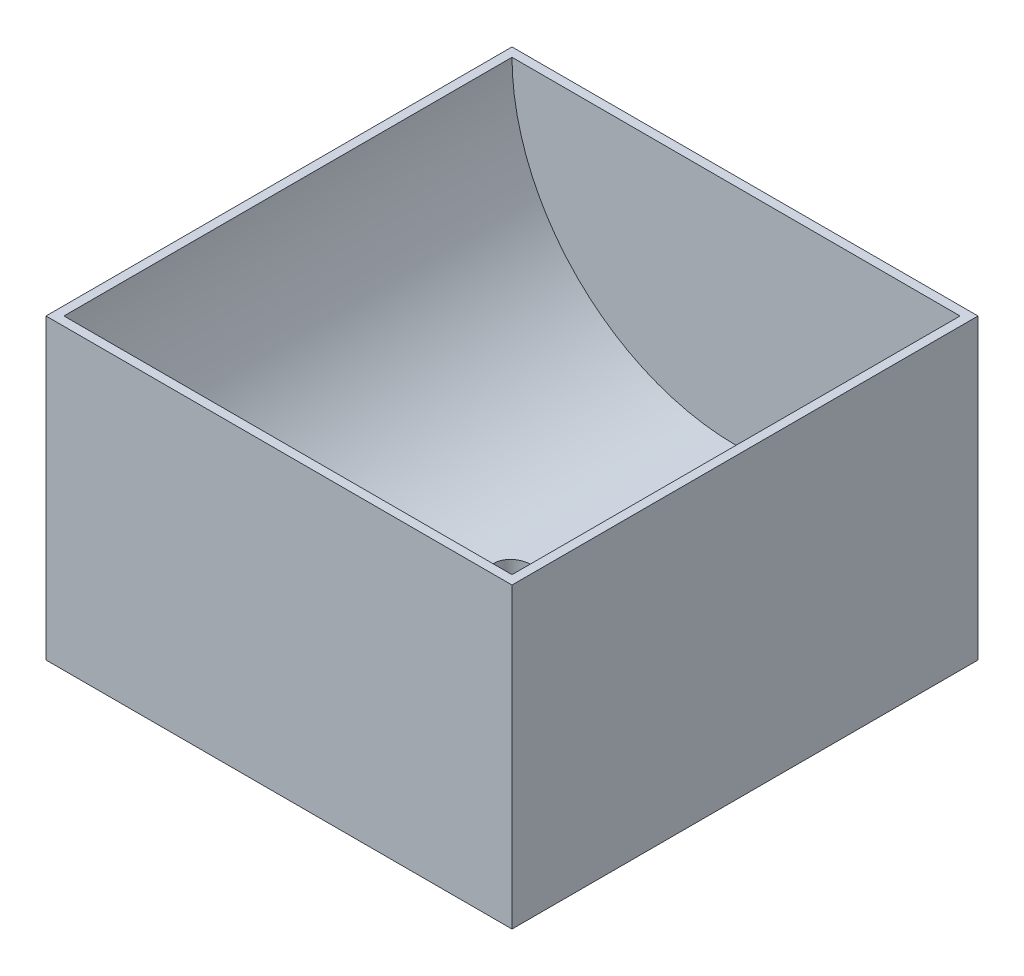
ISO-10303-21;
HEADER;
FILE_DESCRIPTION(('STEP AP214'),'2;1');
FILE_NAME('part.step','',(''),(''),'','','');
FILE_SCHEMA(('AUTOMOTIVE_DESIGN { 1 0 10303 214 1 1 1 1 }'));
ENDSEC;
DATA;
#1=APPLICATION_CONTEXT('core data for automotive mechanical design processes');
#2=APPLICATION_PROTOCOL_DEFINITION('international standard','automotive_design',2000,#1);
#3=PRODUCT_CONTEXT('',#1,'mechanical');
#4=PRODUCT('Part','Part','',(#3));
#5=PRODUCT_RELATED_PRODUCT_CATEGORY('part','',(#4));
#6=PRODUCT_DEFINITION_FORMATION('','',#4);
#7=PRODUCT_DEFINITION_CONTEXT('part definition',#1,'design');
#8=PRODUCT_DEFINITION('design','',#6,#7);
#9=PRODUCT_DEFINITION_SHAPE('','',#8);
#10=(LENGTH_UNIT() NAMED_UNIT(*) SI_UNIT(.MILLI.,.METRE.));
#11=(NAMED_UNIT(*) PLANE_ANGLE_UNIT() SI_UNIT($,.RADIAN.));
#12=(NAMED_UNIT(*) SI_UNIT($,.STERADIAN.) SOLID_ANGLE_UNIT());
#13=UNCERTAINTY_MEASURE_WITH_UNIT(LENGTH_MEASURE(1.E-05),#10,'distance_accuracy_value','');
#14=(GEOMETRIC_REPRESENTATION_CONTEXT(3) GLOBAL_UNCERTAINTY_ASSIGNED_CONTEXT((#13)) GLOBAL_UNIT_ASSIGNED_CONTEXT((#10,
#11,#12)) REPRESENTATION_CONTEXT('',''));
#15=CARTESIAN_POINT('',(0.,0.,0.));
#16=DIRECTION('',(0.,0.,1.));
#17=DIRECTION('',(1.,0.,0.));
#18=AXIS2_PLACEMENT_3D('',#15,#16,#17);
#19=CARTESIAN_POINT('',(-3.75277674973257,-66.5,6.5));
#20=DIRECTION('',(0.866025403784439,0.,-0.5));
#21=DIRECTION('',(-0.5,0.,-0.866025403784439));
#22=AXIS2_PLACEMENT_3D('',#19,#20,#21);
#23=PLANE('',#22);
#24=DIRECTION('',(0.,1.,0.));
#25=VECTOR('',#24,1.);
#26=CARTESIAN_POINT('',(-3.75277674973257,-66.5,6.5));
#27=LINE('',#26,#25);
#28=CARTESIAN_POINT('',(-3.75277674973257,-59.5,6.5));
#29=VERTEX_POINT('',#28);
#30=CARTESIAN_POINT('',(-3.75277674973257,-53.,6.5));
#31=VERTEX_POINT('',#30);
#32=EDGE_CURVE('E145',#29,#31,#27,.T.);
#33=ORIENTED_EDGE('',*,*,#32,.F.);
#34=DIRECTION('',(-0.5,0.,-0.866025403784439));
#35=VECTOR('',#34,1.);
#36=CARTESIAN_POINT('',(-3.75277674973257,-59.5,6.5));
#37=LINE('',#36,#35);
#38=CARTESIAN_POINT('',(-7.50555349946513,-59.5,0.));
#39=VERTEX_POINT('',#38);
#40=EDGE_CURVE('E55',#29,#39,#37,.T.);
#41=ORIENTED_EDGE('',*,*,#40,.T.);
#42=DIRECTION('',(0.,1.,0.));
#43=VECTOR('',#42,1.);
#44=CARTESIAN_POINT('',(-7.50555349946513,-66.5,0.));
#45=LINE('',#44,#43);
#46=CARTESIAN_POINT('',(-7.50555349946513,-53.,0.));
#47=VERTEX_POINT('',#46);
#48=EDGE_CURVE('E159',#39,#47,#45,.T.);
#49=ORIENTED_EDGE('',*,*,#48,.T.);
#50=DIRECTION('',(-0.5,0.,-0.866025403784438));
#51=VECTOR('',#50,1.);
#52=CARTESIAN_POINT('',(-3.75277674973257,-53.,6.5));
#53=LINE('',#52,#51);
#54=EDGE_CURVE('E487',#31,#47,#53,.T.);
#55=ORIENTED_EDGE('',*,*,#54,.F.);
#56=EDGE_LOOP('',(#33,#41,#49,#55));
#57=FACE_BOUND('',#56,.T.);
#58=ADVANCED_FACE('F39',(#57),#23,.T.);
#59=CARTESIAN_POINT('',(-7.50555349946513,-66.5,0.));
#60=DIRECTION('',(0.866025403784439,0.,0.5));
#61=DIRECTION('',(0.5,0.,-0.866025403784439));
#62=AXIS2_PLACEMENT_3D('',#59,#60,#61);
#63=PLANE('',#62);
#64=ORIENTED_EDGE('',*,*,#48,.F.);
#65=DIRECTION('',(0.5,0.,-0.866025403784439));
#66=VECTOR('',#65,1.);
#67=CARTESIAN_POINT('',(-7.50555349946513,-59.5,0.));
#68=LINE('',#67,#66);
#69=CARTESIAN_POINT('',(-3.75277674973257,-59.5,-6.5));
#70=VERTEX_POINT('',#69);
#71=EDGE_CURVE('E492',#39,#70,#68,.T.);
#72=ORIENTED_EDGE('',*,*,#71,.T.);
#73=DIRECTION('',(0.,1.,0.));
#74=VECTOR('',#73,1.);
#75=CARTESIAN_POINT('',(-3.75277674973257,-66.5,-6.5));
#76=LINE('',#75,#74);
#77=CARTESIAN_POINT('',(-3.75277674973257,-53.,-6.5));
#78=VERTEX_POINT('',#77);
#79=EDGE_CURVE('E156',#70,#78,#76,.T.);
#80=ORIENTED_EDGE('',*,*,#79,.T.);
#81=DIRECTION('',(0.5,0.,-0.866025403784439));
#82=VECTOR('',#81,1.);
#83=CARTESIAN_POINT('',(-7.50555349946513,-53.,0.));
#84=LINE('',#83,#82);
#85=EDGE_CURVE('E483',#47,#78,#84,.T.);
#86=ORIENTED_EDGE('',*,*,#85,.F.);
#87=EDGE_LOOP('',(#64,#72,#80,#86));
#88=FACE_BOUND('',#87,.T.);
#89=ADVANCED_FACE('F278',(#88),#63,.T.);
#90=CARTESIAN_POINT('',(-3.75277674973257,-66.5,-6.5));
#91=DIRECTION('',(0.,0.,1.));
#92=DIRECTION('',(1.,0.,0.));
#93=AXIS2_PLACEMENT_3D('',#90,#91,#92);
#94=PLANE('',#93);
#95=ORIENTED_EDGE('',*,*,#79,.F.);
#96=DIRECTION('',(1.,0.,0.));
#97=VECTOR('',#96,1.);
#98=CARTESIAN_POINT('',(-3.75277674973257,-59.5,-6.5));
#99=LINE('',#98,#97);
#100=CARTESIAN_POINT('',(3.75277674973257,-59.5,-6.5));
#101=VERTEX_POINT('',#100);
#102=EDGE_CURVE('E496',#70,#101,#99,.T.);
#103=ORIENTED_EDGE('',*,*,#102,.T.);
#104=DIRECTION('',(0.,1.,0.));
#105=VECTOR('',#104,1.);
#106=CARTESIAN_POINT('',(3.75277674973257,-66.5,-6.5));
#107=LINE('',#106,#105);
#108=CARTESIAN_POINT('',(3.75277674973257,-53.,-6.5));
#109=VERTEX_POINT('',#108);
#110=EDGE_CURVE('E149',#101,#109,#107,.T.);
#111=ORIENTED_EDGE('',*,*,#110,.T.);
#112=DIRECTION('',(1.,0.,0.));
#113=VECTOR('',#112,1.);
#114=CARTESIAN_POINT('',(-3.75277674973257,-53.,-6.5));
#115=LINE('',#114,#113);
#116=EDGE_CURVE('E478',#78,#109,#115,.T.);
#117=ORIENTED_EDGE('',*,*,#116,.F.);
#118=EDGE_LOOP('',(#95,#103,#111,#117));
#119=FACE_BOUND('',#118,.T.);
#120=ADVANCED_FACE('F283',(#119),#94,.T.);
#121=CARTESIAN_POINT('',(3.75277674973257,-66.5,-6.5));
#122=DIRECTION('',(-0.866025403784439,0.,0.5));
#123=DIRECTION('',(0.5,0.,0.866025403784439));
#124=AXIS2_PLACEMENT_3D('',#121,#122,#123);
#125=PLANE('',#124);
#126=ORIENTED_EDGE('',*,*,#110,.F.);
#127=DIRECTION('',(0.5,0.,0.866025403784439));
#128=VECTOR('',#127,1.);
#129=CARTESIAN_POINT('',(3.75277674973257,-59.5,-6.5));
#130=LINE('',#129,#128);
#131=CARTESIAN_POINT('',(7.50555349946513,-59.5,0.));
#132=VERTEX_POINT('',#131);
#133=EDGE_CURVE('E137',#101,#132,#130,.T.);
#134=ORIENTED_EDGE('',*,*,#133,.T.);
#135=DIRECTION('',(0.,1.,0.));
#136=VECTOR('',#135,1.);
#137=CARTESIAN_POINT('',(7.50555349946513,-66.5,0.));
#138=LINE('',#137,#136);
#139=CARTESIAN_POINT('',(7.50555349946513,-53.,0.));
#140=VERTEX_POINT('',#139);
#141=EDGE_CURVE('E135',#132,#140,#138,.T.);
#142=ORIENTED_EDGE('',*,*,#141,.T.);
#143=DIRECTION('',(0.5,0.,0.866025403784439));
#144=VECTOR('',#143,1.);
#145=CARTESIAN_POINT('',(3.75277674973257,-53.,-6.5));
#146=LINE('',#145,#144);
#147=EDGE_CURVE('E473',#109,#140,#146,.T.);
#148=ORIENTED_EDGE('',*,*,#147,.F.);
#149=EDGE_LOOP('',(#126,#134,#142,#148));
#150=FACE_BOUND('',#149,.T.);
#151=ADVANCED_FACE('F289',(#150),#125,.T.);
#152=CARTESIAN_POINT('',(7.50555349946513,-66.5,0.));
#153=DIRECTION('',(-0.866025403784439,0.,-0.5));
#154=DIRECTION('',(-0.5,0.,0.866025403784439));
#155=AXIS2_PLACEMENT_3D('',#152,#153,#154);
#156=PLANE('',#155);
#157=ORIENTED_EDGE('',*,*,#141,.F.);
#158=DIRECTION('',(-0.5,0.,0.866025403784439));
#159=VECTOR('',#158,1.);
#160=CARTESIAN_POINT('',(7.50555349946513,-59.5,0.));
#161=LINE('',#160,#159);
#162=CARTESIAN_POINT('',(3.75277674973257,-59.5,6.5));
#163=VERTEX_POINT('',#162);
#164=EDGE_CURVE('E129',#132,#163,#161,.T.);
#165=ORIENTED_EDGE('',*,*,#164,.T.);
#166=DIRECTION('',(0.,1.,0.));
#167=VECTOR('',#166,1.);
#168=CARTESIAN_POINT('',(3.75277674973257,-66.5,6.5));
#169=LINE('',#168,#167);
#170=CARTESIAN_POINT('',(3.75277674973257,-53.,6.5));
#171=VERTEX_POINT('',#170);
#172=EDGE_CURVE('E62',#163,#171,#169,.T.);
#173=ORIENTED_EDGE('',*,*,#172,.T.);
#174=DIRECTION('',(-0.5,0.,0.866025403784439));
#175=VECTOR('',#174,1.);
#176=CARTESIAN_POINT('',(7.50555349946513,-53.,0.));
#177=LINE('',#176,#175);
#178=EDGE_CURVE('E463',#140,#171,#177,.T.);
#179=ORIENTED_EDGE('',*,*,#178,.F.);
#180=EDGE_LOOP('',(#157,#165,#173,#179));
#181=FACE_BOUND('',#180,.T.);
#182=ADVANCED_FACE('F134',(#181),#156,.T.);
#183=CARTESIAN_POINT('',(3.75277674973257,-66.5,6.5));
#184=DIRECTION('',(0.,0.,-1.));
#185=DIRECTION('',(-1.,0.,0.));
#186=AXIS2_PLACEMENT_3D('',#183,#184,#185);
#187=PLANE('',#186);
#188=ORIENTED_EDGE('',*,*,#172,.F.);
#189=DIRECTION('',(-1.,0.,0.));
#190=VECTOR('',#189,1.);
#191=CARTESIAN_POINT('',(3.75277674973257,-59.5,6.5));
#192=LINE('',#191,#190);
#193=EDGE_CURVE('E11',#163,#29,#192,.T.);
#194=ORIENTED_EDGE('',*,*,#193,.T.);
#195=ORIENTED_EDGE('',*,*,#32,.T.);
#196=DIRECTION('',(-1.,0.,0.));
#197=VECTOR('',#196,1.);
#198=CARTESIAN_POINT('',(3.75277674973257,-53.,6.5));
#199=LINE('',#198,#197);
#200=EDGE_CURVE('E142',#171,#31,#199,.T.);
#201=ORIENTED_EDGE('',*,*,#200,.F.);
#202=EDGE_LOOP('',(#188,#194,#195,#201));
#203=FACE_BOUND('',#202,.T.);
#204=ADVANCED_FACE('F140',(#203),#187,.T.);
#205=CARTESIAN_POINT('',(-52.,0.,50.));
#206=DIRECTION('',(1.,0.,0.));
#207=DIRECTION('',(0.,1.,0.));
#208=AXIS2_PLACEMENT_3D('',#205,#206,#207);
#209=PLANE('',#208);
#210=DIRECTION('',(0.,0.,-1.));
#211=VECTOR('',#210,1.);
#212=CARTESIAN_POINT('',(-52.,0.,50.));
#213=LINE('',#212,#211);
#214=CARTESIAN_POINT('',(-52.,0.,52.));
#215=VERTEX_POINT('',#214);
#216=CARTESIAN_POINT('',(-52.,0.,-52.));
#217=VERTEX_POINT('',#216);
#218=EDGE_CURVE('E218',#215,#217,#213,.T.);
#219=ORIENTED_EDGE('',*,*,#218,.T.);
#220=DIRECTION('',(0.,1.,0.));
#221=VECTOR('',#220,1.);
#222=CARTESIAN_POINT('',(-52.,0.,-52.));
#223=LINE('',#222,#221);
#224=CARTESIAN_POINT('',(-52.,-66.5,-52.));
#225=VERTEX_POINT('',#224);
#226=EDGE_CURVE('E186',#225,#217,#223,.T.);
#227=ORIENTED_EDGE('',*,*,#226,.F.);
#228=DIRECTION('',(0.,0.,-1.));
#229=VECTOR('',#228,1.);
#230=CARTESIAN_POINT('',(-52.,-66.5,-52.));
#231=LINE('',#230,#229);
#232=CARTESIAN_POINT('',(-52.,-66.5,52.));
#233=VERTEX_POINT('',#232);
#234=EDGE_CURVE('E162',#233,#225,#231,.T.);
#235=ORIENTED_EDGE('',*,*,#234,.F.);
#236=DIRECTION('',(0.,-1.,0.));
#237=VECTOR('',#236,1.);
#238=CARTESIAN_POINT('',(-52.,0.,52.));
#239=LINE('',#238,#237);
#240=EDGE_CURVE('E199',#215,#233,#239,.T.);
#241=ORIENTED_EDGE('',*,*,#240,.F.);
#242=EDGE_LOOP('',(#219,#227,#235,#241));
#243=FACE_BOUND('',#242,.T.);
#244=ADVANCED_FACE('F41',(#243),#209,.F.);
#245=CARTESIAN_POINT('',(-52.,-53.,50.));
#246=DIRECTION('',(0.,1.,0.));
#247=DIRECTION('',(0.,0.,1.));
#248=AXIS2_PLACEMENT_3D('',#245,#246,#247);
#249=PLANE('',#248);
#250=ORIENTED_EDGE('',*,*,#178,.T.);
#251=ORIENTED_EDGE('',*,*,#200,.T.);
#252=ORIENTED_EDGE('',*,*,#54,.T.);
#253=ORIENTED_EDGE('',*,*,#85,.T.);
#254=ORIENTED_EDGE('',*,*,#116,.T.);
#255=ORIENTED_EDGE('',*,*,#147,.T.);
#256=EDGE_LOOP('',(#250,#251,#252,#253,#254,#255));
#257=FACE_BOUND('',#256,.T.);
#258=CARTESIAN_POINT('',(0.,-53.,0.));
#259=DIRECTION('',(0.,-1.,0.));
#260=DIRECTION('',(0.,0.,-1.));
#261=AXIS2_PLACEMENT_3D('',#258,#259,#260);
#262=CIRCLE('',#261,4.05);
#263=CARTESIAN_POINT('',(0.,-53.,-4.05));
#264=VERTEX_POINT('',#263);
#265=EDGE_CURVE('E178',#264,#264,#262,.T.);
#266=ORIENTED_EDGE('',*,*,#265,.F.);
#267=EDGE_LOOP('',(#266));
#268=FACE_BOUND('',#267,.T.);
#269=ADVANCED_FACE('F372',(#257,#268),#249,.F.);
#270=CARTESIAN_POINT('',(52.,0.,50.));
#271=DIRECTION('',(-1.,0.,0.));
#272=DIRECTION('',(0.,0.,1.));
#273=AXIS2_PLACEMENT_3D('',#270,#271,#272);
#274=PLANE('',#273);
#275=DIRECTION('',(0.,1.,0.));
#276=VECTOR('',#275,1.);
#277=CARTESIAN_POINT('',(52.,0.,52.));
#278=LINE('',#277,#276);
#279=CARTESIAN_POINT('',(52.,-66.5,52.));
#280=VERTEX_POINT('',#279);
#281=CARTESIAN_POINT('',(52.,0.,52.));
#282=VERTEX_POINT('',#281);
#283=EDGE_CURVE('E202',#280,#282,#278,.T.);
#284=ORIENTED_EDGE('',*,*,#283,.F.);
#285=DIRECTION('',(0.,0.,1.));
#286=VECTOR('',#285,1.);
#287=CARTESIAN_POINT('',(52.,-66.5,-52.));
#288=LINE('',#287,#286);
#289=CARTESIAN_POINT('',(52.,-66.5,-52.));
#290=VERTEX_POINT('',#289);
#291=EDGE_CURVE('E170',#290,#280,#288,.T.);
#292=ORIENTED_EDGE('',*,*,#291,.F.);
#293=DIRECTION('',(0.,-1.,0.));
#294=VECTOR('',#293,1.);
#295=CARTESIAN_POINT('',(52.,0.,-52.));
#296=LINE('',#295,#294);
#297=CARTESIAN_POINT('',(52.,0.,-52.));
#298=VERTEX_POINT('',#297);
#299=EDGE_CURVE('E183',#298,#290,#296,.T.);
#300=ORIENTED_EDGE('',*,*,#299,.F.);
#301=DIRECTION('',(0.,0.,-1.));
#302=VECTOR('',#301,1.);
#303=CARTESIAN_POINT('',(52.,0.,50.));
#304=LINE('',#303,#302);
#305=EDGE_CURVE('E48',#282,#298,#304,.T.);
#306=ORIENTED_EDGE('',*,*,#305,.F.);
#307=EDGE_LOOP('',(#284,#292,#300,#306));
#308=FACE_BOUND('',#307,.T.);
#309=ADVANCED_FACE('F273',(#308),#274,.F.);
#310=CARTESIAN_POINT('',(0.,0.,50.));
#311=DIRECTION('',(0.,0.,-1.));
#312=DIRECTION('',(-1.,0.,0.));
#313=AXIS2_PLACEMENT_3D('',#310,#311,#312);
#314=CYLINDRICAL_SURFACE('',#313,50.);
#315=CARTESIAN_POINT('',(0.,-50.,-4.05));
#316=CARTESIAN_POINT('',(0.227090939903086,-49.9999978469795,-4.04999007138787));
#317=CARTESIAN_POINT('',(0.454337031226916,-49.998436391622,-4.03083565181419));
#318=CARTESIAN_POINT('',(0.902543371939611,-49.9923575641326,-3.95470601808502));
#319=CARTESIAN_POINT('',(1.1234961771788,-49.9878368316791,-3.89768780773004));
#320=CARTESIAN_POINT('',(1.55255954506248,-49.976350384429,-3.74748882930199));
#321=CARTESIAN_POINT('',(1.76067723646771,-49.9693860414843,-3.65432834853829));
#322=CARTESIAN_POINT('',(2.15827102312419,-49.9537936743108,-3.43452519324597));
#323=CARTESIAN_POINT('',(2.34775112923069,-49.9451660092212,-3.30788974434048));
#324=CARTESIAN_POINT('',(2.70319932325802,-49.9271920279788,-3.02440050090608));
#325=CARTESIAN_POINT('',(2.86911619117887,-49.9178442124,-2.86748257447827));
#326=CARTESIAN_POINT('',(3.17228880475532,-49.8994960934745,-2.52801792828352));
#327=CARTESIAN_POINT('',(3.30954329931065,-49.8904958053112,-2.34547009036337));
#328=CARTESIAN_POINT('',(3.55166697960996,-49.8738454880167,-1.95961917715362));
#329=CARTESIAN_POINT('',(3.65649137594736,-49.8661973325124,-1.75628790847406));
#330=CARTESIAN_POINT('',(3.83049313342033,-49.853134108377,-1.33483857819014));
#331=CARTESIAN_POINT('',(3.89967109293666,-49.8477190022609,-1.11672076487043));
#332=CARTESIAN_POINT('',(4.00026828348998,-49.8397474001978,-0.672401395158286));
#333=CARTESIAN_POINT('',(4.03177068213997,-49.8371846087277,-0.446218783327298));
#334=CARTESIAN_POINT('',(4.05637941997417,-49.8351878322821,0.00823713333554478));
#335=CARTESIAN_POINT('',(4.04948644362306,-49.8357537915311,0.236510400825383));
#336=CARTESIAN_POINT('',(3.99756886325443,-49.8399448564861,0.688098257197177));
#337=CARTESIAN_POINT('',(3.95263459561979,-49.8435627147964,0.911423308412015));
#338=CARTESIAN_POINT('',(3.82605027012938,-49.8534385532174,1.34735108479123));
#339=CARTESIAN_POINT('',(3.74439987106258,-49.8596965578634,1.55995371028934));
#340=CARTESIAN_POINT('',(3.54659971464991,-49.8741558942424,1.96868981303134));
#341=CARTESIAN_POINT('',(3.43040937073787,-49.8823595098824,2.16480356509788));
#342=CARTESIAN_POINT('',(3.16685681738691,-49.899783576383,2.53477927203844));
#343=CARTESIAN_POINT('',(3.01949401201647,-49.9090040466814,2.7086408014093));
#344=CARTESIAN_POINT('',(2.69727268641723,-49.9274551171566,3.02970207242732));
#345=CARTESIAN_POINT('',(2.52233605882309,-49.9366856697999,3.17682343863121));
#346=CARTESIAN_POINT('',(2.15020555836024,-49.9540914563182,3.4396223471129));
#347=CARTESIAN_POINT('',(1.95301167167652,-49.9622666895381,3.55529986987346));
#348=CARTESIAN_POINT('',(1.54191374788775,-49.976642131313,3.75192233229843));
#349=CARTESIAN_POINT('',(1.32800807367569,-49.9828421460705,3.8328638641274));
#350=CARTESIAN_POINT('',(0.889581681012153,-49.9925663086471,3.9576621566234));
#351=CARTESIAN_POINT('',(0.665061170780682,-49.9960905089319,4.00151964441046));
#352=CARTESIAN_POINT('',(0.212457847179055,-50.0000592211759,4.05080677621598));
#353=CARTESIAN_POINT('',(-0.0156131031110761,-50.0005124100439,4.0563446902059));
#354=CARTESIAN_POINT('',(-0.469440248257158,-49.9983111992693,4.02911900993766));
#355=CARTESIAN_POINT('',(-0.69519646347769,-49.99565682699,3.99635575293779));
#356=CARTESIAN_POINT('',(-1.13767750248595,-49.9875446272186,3.89354748560415));
#357=CARTESIAN_POINT('',(-1.3544140464318,-49.9820905689486,3.82355259570535));
#358=CARTESIAN_POINT('',(-1.77306627102588,-49.968991800761,3.64831911518307));
#359=CARTESIAN_POINT('',(-1.97498172984677,-49.9613470580639,3.54307999718994));
#360=CARTESIAN_POINT('',(-2.35875325348316,-49.9447025161237,3.30007288353467));
#361=CARTESIAN_POINT('',(-2.54056372250733,-49.9356997419933,3.16223308714278));
#362=CARTESIAN_POINT('',(-2.87850423228245,-49.9173608146792,2.85804120074663));
#363=CARTESIAN_POINT('',(-3.03463385139561,-49.908024656025,2.69168864270074));
#364=CARTESIAN_POINT('',(-3.317151517894,-49.8900455809047,2.3347238850466));
#365=CARTESIAN_POINT('',(-3.44346896418193,-49.8814043413963,2.14405571247225));
#366=CARTESIAN_POINT('',(-3.66229265843081,-49.8658169322881,1.74415104162806));
#367=CARTESIAN_POINT('',(-3.75479922794991,-49.8588707465679,1.53491471997403));
#368=CARTESIAN_POINT('',(-3.90325472995967,-49.8474691195189,1.1040641835512));
#369=CARTESIAN_POINT('',(-3.95924703427394,-49.8430107240931,0.88246499450336));
#370=CARTESIAN_POINT('',(-4.03322585682477,-49.8370794503004,0.432972987740299));
#371=CARTESIAN_POINT('',(-4.05121306011099,-49.83560651812,0.205080283541979));
#372=CARTESIAN_POINT('',(-4.04866336240868,-49.8358136681861,-0.24982806036282));
#373=CARTESIAN_POINT('',(-4.0282373975143,-49.837484670848,-0.476844334238529));
#374=CARTESIAN_POINT('',(-3.94967234003041,-49.8437721244715,-0.924211060666271));
#375=CARTESIAN_POINT('',(-3.89153318832307,-49.8483885800503,-1.14456150276862));
#376=CARTESIAN_POINT('',(-3.73921986488515,-49.8600444025469,-1.57234994976785));
#377=CARTESIAN_POINT('',(-3.64504751923221,-49.8670836466816,-1.77978860838432));
#378=CARTESIAN_POINT('',(-3.42335367642745,-49.8827920656305,-2.17592934632183));
#379=CARTESIAN_POINT('',(-3.29583274537126,-49.8914612127763,-2.3646317436178));
#380=CARTESIAN_POINT('',(-3.0106450768539,-49.9094823564934,-2.71851077640229));
#381=CARTESIAN_POINT('',(-2.85289634042092,-49.9188361666858,-2.88362123694192));
#382=CARTESIAN_POINT('',(-2.51187682622816,-49.937156186508,-3.18508611056836));
#383=CARTESIAN_POINT('',(-2.32859987388635,-49.9461223016753,-3.32143354653823));
#384=CARTESIAN_POINT('',(-1.94139187622709,-49.9626719582881,-3.56167408684266));
#385=CARTESIAN_POINT('',(-1.73742462717475,-49.9702530089196,-3.66550895728889));
#386=CARTESIAN_POINT('',(-1.31502970488182,-49.9831487490369,-3.8373253570647));
#387=CARTESIAN_POINT('',(-1.09661902192542,-49.988466048526,-3.90534819759249));
#388=CARTESIAN_POINT('',(-0.73076142414999,-49.9948665462344,-3.98624056747078));
#389=CARTESIAN_POINT('',(-0.585668997356005,-49.9967828541602,-4.01011868452085));
#390=CARTESIAN_POINT('',(-0.293739352505234,-49.9993502758517,-4.04200159241213));
#391=CARTESIAN_POINT('',(-0.146902138784056,-50.0000013927606,-4.05000642268845));
#392=CARTESIAN_POINT('',(0.,-50.,-4.05));
#393=B_SPLINE_CURVE_WITH_KNOTS('',3,(#315,#316,#317,#318,#319,#320,#321,#322,#323,#324,#325,
#326,#327,#328,#329,#330,#331,#332,#333,#334,#335,#336,#337,#338,#339,#340,#341,#342,#343,#344,
#345,#346,#347,#348,#349,#350,#351,#352,#353,#354,#355,#356,#357,#358,#359,#360,#361,#362,#363,
#364,#365,#366,#367,#368,#369,#370,#371,#372,#373,#374,#375,#376,#377,#378,#379,#380,#381,#382,
#383,#384,#385,#386,#387,#388,#389,#390,#391,#392),.UNSPECIFIED.,.T.,.F.,(4,2,2,2,2,2,2,2,2,2,2,
2,2,2,2,2,2,2,2,2,2,2,2,2,2,2,2,2,2,2,2,2,2,2,2,2,2,2,4),(0.,0.680736475693857,1.36224728605987,
2.04337610429466,2.7243580197146,3.4067982593917,4.08926828106786,4.77267670131856,
5.45607364912454,6.13795921867426,6.81983263246061,7.50009133361316,8.18035635668904,
8.86142391429793,9.54250449321805,10.2255502135674,10.9085963578834,11.5917094983312,
12.2748092444264,12.9559781365748,13.6371410307832,14.317389270015,14.9976476884543,
15.6794185143938,16.3612005327847,17.0445812975891,17.7279555629356,18.4105166273101,
19.0930653882776,19.7736459951036,20.4542276687861,21.1347748567552,21.8153104931161,
22.4977190442788,23.180292939084,23.8640825028642,24.5470815388193,24.98744209531,
25.4278015577809),.UNSPECIFIED.);
#394=CARTESIAN_POINT('',(0.,-50.,-4.05));
#395=VERTEX_POINT('',#394);
#396=EDGE_CURVE('E182',#395,#395,#393,.T.);
#397=ORIENTED_EDGE('',*,*,#396,.T.);
#398=EDGE_LOOP('',(#397));
#399=FACE_BOUND('',#398,.T.);
#400=CARTESIAN_POINT('',(0.,0.,-50.));
#401=DIRECTION('',(0.,0.,-1.));
#402=DIRECTION('',(1.,0.,0.));
#403=AXIS2_PLACEMENT_3D('',#400,#401,#402);
#404=CIRCLE('',#403,50.);
#405=CARTESIAN_POINT('',(50.,0.,-50.));
#406=VERTEX_POINT('',#405);
#407=CARTESIAN_POINT('',(-50.,0.,-50.));
#408=VERTEX_POINT('',#407);
#409=EDGE_CURVE('E210',#406,#408,#404,.T.);
#410=ORIENTED_EDGE('',*,*,#409,.T.);
#411=DIRECTION('',(0.,0.,-1.));
#412=VECTOR('',#411,1.);
#413=CARTESIAN_POINT('',(-50.,0.,50.));
#414=LINE('',#413,#412);
#415=CARTESIAN_POINT('',(-50.,0.,50.));
#416=VERTEX_POINT('',#415);
#417=EDGE_CURVE('E224',#416,#408,#414,.T.);
#418=ORIENTED_EDGE('',*,*,#417,.F.);
#419=CARTESIAN_POINT('',(0.,0.,50.));
#420=DIRECTION('',(0.,0.,-1.));
#421=DIRECTION('',(1.,0.,0.));
#422=AXIS2_PLACEMENT_3D('',#419,#420,#421);
#423=CIRCLE('',#422,50.);
#424=CARTESIAN_POINT('',(50.,0.,50.));
#425=VERTEX_POINT('',#424);
#426=EDGE_CURVE('E214',#425,#416,#423,.T.);
#427=ORIENTED_EDGE('',*,*,#426,.F.);
#428=DIRECTION('',(0.,0.,-1.));
#429=VECTOR('',#428,1.);
#430=CARTESIAN_POINT('',(50.,0.,50.));
#431=LINE('',#430,#429);
#432=EDGE_CURVE('E228',#425,#406,#431,.T.);
#433=ORIENTED_EDGE('',*,*,#432,.T.);
#434=EDGE_LOOP('',(#410,#418,#427,#433));
#435=FACE_BOUND('',#434,.T.);
#436=ADVANCED_FACE('F240',(#399,#435),#314,.F.);
#437=CARTESIAN_POINT('',(-52.,0.,50.));
#438=DIRECTION('',(0.,-1.,0.));
#439=DIRECTION('',(0.,0.,-1.));
#440=AXIS2_PLACEMENT_3D('',#437,#438,#439);
#441=PLANE('',#440);
#442=DIRECTION('',(1.,0.,0.));
#443=VECTOR('',#442,1.);
#444=CARTESIAN_POINT('',(52.,0.,-52.));
#445=LINE('',#444,#443);
#446=EDGE_CURVE('E191',#217,#298,#445,.T.);
#447=ORIENTED_EDGE('',*,*,#446,.F.);
#448=ORIENTED_EDGE('',*,*,#218,.F.);
#449=DIRECTION('',(-1.,0.,0.));
#450=VECTOR('',#449,1.);
#451=CARTESIAN_POINT('',(-52.,0.,52.));
#452=LINE('',#451,#450);
#453=EDGE_CURVE('E206',#282,#215,#452,.T.);
#454=ORIENTED_EDGE('',*,*,#453,.F.);
#455=ORIENTED_EDGE('',*,*,#305,.T.);
#456=EDGE_LOOP('',(#447,#448,#454,#455));
#457=FACE_BOUND('',#456,.T.);
#458=ORIENTED_EDGE('',*,*,#417,.T.);
#459=DIRECTION('',(1.,0.,0.));
#460=VECTOR('',#459,1.);
#461=CARTESIAN_POINT('',(52.,0.,-50.));
#462=LINE('',#461,#460);
#463=EDGE_CURVE('E187',#408,#406,#462,.T.);
#464=ORIENTED_EDGE('',*,*,#463,.T.);
#465=ORIENTED_EDGE('',*,*,#432,.F.);
#466=DIRECTION('',(-1.,0.,0.));
#467=VECTOR('',#466,1.);
#468=CARTESIAN_POINT('',(-52.,0.,50.));
#469=LINE('',#468,#467);
#470=EDGE_CURVE('E195',#425,#416,#469,.T.);
#471=ORIENTED_EDGE('',*,*,#470,.T.);
#472=EDGE_LOOP('',(#458,#464,#465,#471));
#473=FACE_BOUND('',#472,.T.);
#474=ADVANCED_FACE('F266',(#457,#473),#441,.F.);
#475=CARTESIAN_POINT('',(0.,0.,50.));
#476=DIRECTION('',(0.,0.,1.));
#477=DIRECTION('',(1.,0.,0.));
#478=AXIS2_PLACEMENT_3D('',#475,#476,#477);
#479=PLANE('',#478);
#480=ORIENTED_EDGE('',*,*,#470,.F.);
#481=ORIENTED_EDGE('',*,*,#426,.T.);
#482=EDGE_LOOP('',(#480,#481));
#483=FACE_BOUND('',#482,.T.);
#484=ADVANCED_FACE('F263',(#483),#479,.F.);
#485=CARTESIAN_POINT('',(0.,0.,52.));
#486=DIRECTION('',(0.,0.,1.));
#487=DIRECTION('',(1.,0.,0.));
#488=AXIS2_PLACEMENT_3D('',#485,#486,#487);
#489=PLANE('',#488);
#490=ORIENTED_EDGE('',*,*,#240,.T.);
#491=DIRECTION('',(-1.,0.,0.));
#492=VECTOR('',#491,1.);
#493=CARTESIAN_POINT('',(-52.,-66.5,52.));
#494=LINE('',#493,#492);
#495=EDGE_CURVE('E174',#280,#233,#494,.T.);
#496=ORIENTED_EDGE('',*,*,#495,.F.);
#497=ORIENTED_EDGE('',*,*,#283,.T.);
#498=ORIENTED_EDGE('',*,*,#453,.T.);
#499=EDGE_LOOP('',(#490,#496,#497,#498));
#500=FACE_BOUND('',#499,.T.);
#501=ADVANCED_FACE('F259',(#500),#489,.T.);
#502=CARTESIAN_POINT('',(0.,0.,-50.));
#503=DIRECTION('',(0.,0.,-1.));
#504=DIRECTION('',(-1.,0.,0.));
#505=AXIS2_PLACEMENT_3D('',#502,#503,#504);
#506=PLANE('',#505);
#507=ORIENTED_EDGE('',*,*,#409,.F.);
#508=ORIENTED_EDGE('',*,*,#463,.F.);
#509=EDGE_LOOP('',(#507,#508));
#510=FACE_BOUND('',#509,.T.);
#511=ADVANCED_FACE('F255',(#510),#506,.F.);
#512=CARTESIAN_POINT('',(0.,0.,-52.));
#513=DIRECTION('',(0.,0.,-1.));
#514=DIRECTION('',(-1.,0.,0.));
#515=AXIS2_PLACEMENT_3D('',#512,#513,#514);
#516=PLANE('',#515);
#517=ORIENTED_EDGE('',*,*,#299,.T.);
#518=DIRECTION('',(1.,0.,0.));
#519=VECTOR('',#518,1.);
#520=CARTESIAN_POINT('',(-52.,-66.5,-52.));
#521=LINE('',#520,#519);
#522=EDGE_CURVE('E166',#225,#290,#521,.T.);
#523=ORIENTED_EDGE('',*,*,#522,.F.);
#524=ORIENTED_EDGE('',*,*,#226,.T.);
#525=ORIENTED_EDGE('',*,*,#446,.T.);
#526=EDGE_LOOP('',(#517,#523,#524,#525));
#527=FACE_BOUND('',#526,.T.);
#528=ADVANCED_FACE('F250',(#527),#516,.T.);
#529=CARTESIAN_POINT('',(0.,0.,0.));
#530=DIRECTION('',(0.,-1.,0.));
#531=DIRECTION('',(0.,0.,-1.));
#532=AXIS2_PLACEMENT_3D('',#529,#530,#531);
#533=CYLINDRICAL_SURFACE('',#532,4.05);
#534=ORIENTED_EDGE('',*,*,#265,.T.);
#535=EDGE_LOOP('',(#534));
#536=FACE_BOUND('',#535,.T.);
#537=ORIENTED_EDGE('',*,*,#396,.F.);
#538=EDGE_LOOP('',(#537));
#539=FACE_BOUND('',#538,.T.);
#540=ADVANCED_FACE('F244',(#536,#539),#533,.F.);
#541=CARTESIAN_POINT('',(0.,-66.5,0.));
#542=DIRECTION('',(0.,1.,0.));
#543=DIRECTION('',(0.,0.,1.));
#544=AXIS2_PLACEMENT_3D('',#541,#542,#543);
#545=PLANE('',#544);
#546=CARTESIAN_POINT('',(0.,-66.5,0.));
#547=DIRECTION('',(0.,-1.,0.));
#548=DIRECTION('',(0.,0.,-1.));
#549=AXIS2_PLACEMENT_3D('',#546,#547,#548);
#550=CIRCLE('',#549,8.);
#551=CARTESIAN_POINT('',(0.,-66.5,-8.));
#552=VERTEX_POINT('',#551);
#553=EDGE_CURVE('E502',#552,#552,#550,.T.);
#554=ORIENTED_EDGE('',*,*,#553,.F.);
#555=EDGE_LOOP('',(#554));
#556=FACE_BOUND('',#555,.T.);
#557=ORIENTED_EDGE('',*,*,#234,.T.);
#558=ORIENTED_EDGE('',*,*,#522,.T.);
#559=ORIENTED_EDGE('',*,*,#291,.T.);
#560=ORIENTED_EDGE('',*,*,#495,.T.);
#561=EDGE_LOOP('',(#557,#558,#559,#560));
#562=FACE_BOUND('',#561,.T.);
#563=ADVANCED_FACE('F249',(#556,#562),#545,.F.);
#564=CARTESIAN_POINT('',(0.,-59.5,0.));
#565=DIRECTION('',(0.,-1.,0.));
#566=DIRECTION('',(0.,0.,-1.));
#567=AXIS2_PLACEMENT_3D('',#564,#565,#566);
#568=CYLINDRICAL_SURFACE('',#567,8.);
#569=CARTESIAN_POINT('',(0.,-59.5,0.));
#570=DIRECTION('',(0.,-1.,0.));
#571=DIRECTION('',(0.,0.,-1.));
#572=AXIS2_PLACEMENT_3D('',#569,#570,#571);
#573=CIRCLE('',#572,8.);
#574=CARTESIAN_POINT('',(0.,-59.5,-8.));
#575=VERTEX_POINT('',#574);
#576=EDGE_CURVE('E138',#575,#575,#573,.T.);
#577=ORIENTED_EDGE('',*,*,#576,.F.);
#578=EDGE_LOOP('',(#577));
#579=FACE_BOUND('',#578,.T.);
#580=ORIENTED_EDGE('',*,*,#553,.T.);
#581=EDGE_LOOP('',(#580));
#582=FACE_BOUND('',#581,.T.);
#583=ADVANCED_FACE('F298',(#579,#582),#568,.F.);
#584=CARTESIAN_POINT('',(0.,-59.5,0.));
#585=DIRECTION('',(0.,-1.,0.));
#586=DIRECTION('',(0.,0.,-1.));
#587=AXIS2_PLACEMENT_3D('',#584,#585,#586);
#588=PLANE('',#587);
#589=ORIENTED_EDGE('',*,*,#193,.F.);
#590=ORIENTED_EDGE('',*,*,#164,.F.);
#591=ORIENTED_EDGE('',*,*,#133,.F.);
#592=ORIENTED_EDGE('',*,*,#102,.F.);
#593=ORIENTED_EDGE('',*,*,#71,.F.);
#594=ORIENTED_EDGE('',*,*,#40,.F.);
#595=EDGE_LOOP('',(#589,#590,#591,#592,#593,#594));
#596=FACE_BOUND('',#595,.T.);
#597=ORIENTED_EDGE('',*,*,#576,.T.);
#598=EDGE_LOOP('',(#597));
#599=FACE_BOUND('',#598,.T.);
#600=ADVANCED_FACE('F127',(#596,#599),#588,.T.);
#601=CLOSED_SHELL('',(#58,#89,#120,#151,#182,#204,#244,#269,#309,#436,#474,#484,#501,#511,#528,
#540,#563,#583,#600));
#602=MANIFOLD_SOLID_BREP('B2',#601);
#603=ADVANCED_BREP_SHAPE_REPRESENTATION('',(#18,#602),#14);
#604=SHAPE_DEFINITION_REPRESENTATION(#9,#603);
ENDSEC;
END-ISO-10303-21;
